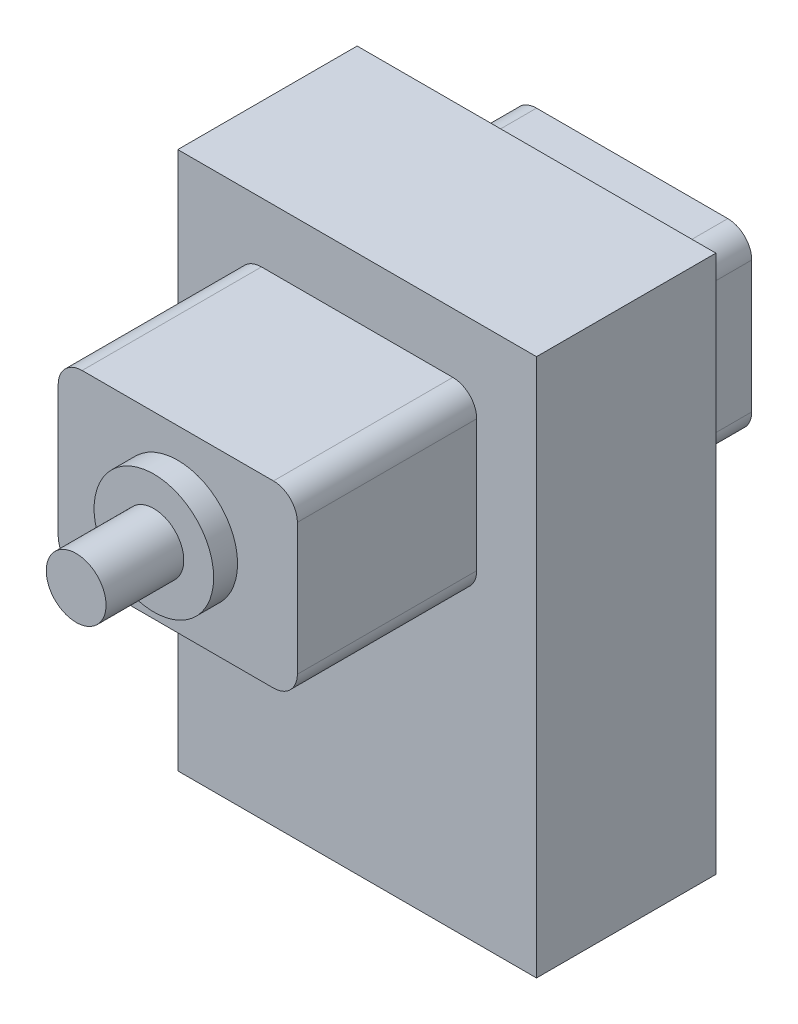
ISO-10303-21;
HEADER;
FILE_DESCRIPTION(('STEP AP214'),'2;1');
FILE_NAME('part.step','',(''),(''),'','','');
FILE_SCHEMA(('AUTOMOTIVE_DESIGN { 1 0 10303 214 1 1 1 1 }'));
ENDSEC;
DATA;
#1=APPLICATION_CONTEXT('core data for automotive mechanical design processes');
#2=APPLICATION_PROTOCOL_DEFINITION('international standard','automotive_design',2000,#1);
#3=PRODUCT_CONTEXT('',#1,'mechanical');
#4=PRODUCT('Part','Part','',(#3));
#5=PRODUCT_RELATED_PRODUCT_CATEGORY('part','',(#4));
#6=PRODUCT_DEFINITION_FORMATION('','',#4);
#7=PRODUCT_DEFINITION_CONTEXT('part definition',#1,'design');
#8=PRODUCT_DEFINITION('design','',#6,#7);
#9=PRODUCT_DEFINITION_SHAPE('','',#8);
#10=(LENGTH_UNIT() NAMED_UNIT(*) SI_UNIT(.MILLI.,.METRE.));
#11=(NAMED_UNIT(*) PLANE_ANGLE_UNIT() SI_UNIT($,.RADIAN.));
#12=(NAMED_UNIT(*) SI_UNIT($,.STERADIAN.) SOLID_ANGLE_UNIT());
#13=UNCERTAINTY_MEASURE_WITH_UNIT(LENGTH_MEASURE(1.E-05),#10,'distance_accuracy_value','');
#14=(GEOMETRIC_REPRESENTATION_CONTEXT(3) GLOBAL_UNCERTAINTY_ASSIGNED_CONTEXT((#13)) GLOBAL_UNIT_ASSIGNED_CONTEXT((#10,
#11,#12)) REPRESENTATION_CONTEXT('',''));
#15=CARTESIAN_POINT('',(0.,0.,0.));
#16=DIRECTION('',(0.,0.,1.));
#17=DIRECTION('',(1.,0.,0.));
#18=AXIS2_PLACEMENT_3D('',#15,#16,#17);
#19=CARTESIAN_POINT('',(0.,0.,0.));
#20=DIRECTION('',(0.,0.,1.));
#21=DIRECTION('',(1.,0.,0.));
#22=AXIS2_PLACEMENT_3D('',#19,#20,#21);
#23=PLANE('',#22);
#24=DIRECTION('',(0.,-1.,0.));
#25=VECTOR('',#24,1.);
#26=CARTESIAN_POINT('',(-30.,45.,0.));
#27=LINE('',#26,#25);
#28=CARTESIAN_POINT('',(-30.,45.,0.));
#29=VERTEX_POINT('',#28);
#30=CARTESIAN_POINT('',(-30.,0.,0.));
#31=VERTEX_POINT('',#30);
#32=EDGE_CURVE('E200',#29,#31,#27,.T.);
#33=ORIENTED_EDGE('',*,*,#32,.F.);
#34=DIRECTION('',(-1.,0.,0.));
#35=VECTOR('',#34,1.);
#36=CARTESIAN_POINT('',(-30.,45.,0.));
#37=LINE('',#36,#35);
#38=CARTESIAN_POINT('',(0.,45.,0.));
#39=VERTEX_POINT('',#38);
#40=EDGE_CURVE('E196',#39,#29,#37,.T.);
#41=ORIENTED_EDGE('',*,*,#40,.F.);
#42=DIRECTION('',(0.,1.,0.));
#43=VECTOR('',#42,1.);
#44=CARTESIAN_POINT('',(0.,45.,0.));
#45=LINE('',#44,#43);
#46=CARTESIAN_POINT('',(0.,0.,0.));
#47=VERTEX_POINT('',#46);
#48=EDGE_CURVE('E333',#47,#39,#45,.T.);
#49=ORIENTED_EDGE('',*,*,#48,.F.);
#50=DIRECTION('',(1.,0.,0.));
#51=VECTOR('',#50,1.);
#52=CARTESIAN_POINT('',(-30.,0.,0.));
#53=LINE('',#52,#51);
#54=EDGE_CURVE('E331',#31,#47,#53,.T.);
#55=ORIENTED_EDGE('',*,*,#54,.F.);
#56=EDGE_LOOP('',(#33,#41,#49,#55));
#57=FACE_BOUND('',#56,.T.);
#58=DIRECTION('',(0.,-1.,0.));
#59=VECTOR('',#58,1.);
#60=CARTESIAN_POINT('',(-5.,40.,0.));
#61=LINE('',#60,#59);
#62=CARTESIAN_POINT('',(-5.,38.,0.));
#63=VERTEX_POINT('',#62);
#64=CARTESIAN_POINT('',(-5.,27.,0.));
#65=VERTEX_POINT('',#64);
#66=EDGE_CURVE('E295',#63,#65,#61,.T.);
#67=ORIENTED_EDGE('',*,*,#66,.F.);
#68=CARTESIAN_POINT('',(-7.,38.,0.));
#69=DIRECTION('',(0.,0.,1.));
#70=DIRECTION('',(1.,0.,0.));
#71=AXIS2_PLACEMENT_3D('',#68,#69,#70);
#72=CIRCLE('',#71,2.);
#73=CARTESIAN_POINT('',(-7.,40.,0.));
#74=VERTEX_POINT('',#73);
#75=EDGE_CURVE('E53',#63,#74,#72,.T.);
#76=ORIENTED_EDGE('',*,*,#75,.T.);
#77=DIRECTION('',(1.,0.,0.));
#78=VECTOR('',#77,1.);
#79=CARTESIAN_POINT('',(-5.,40.,0.));
#80=LINE('',#79,#78);
#81=CARTESIAN_POINT('',(-23.,40.,0.));
#82=VERTEX_POINT('',#81);
#83=EDGE_CURVE('E285',#82,#74,#80,.T.);
#84=ORIENTED_EDGE('',*,*,#83,.F.);
#85=CARTESIAN_POINT('',(-23.,38.,0.));
#86=DIRECTION('',(0.,0.,1.));
#87=DIRECTION('',(1.,0.,0.));
#88=AXIS2_PLACEMENT_3D('',#85,#86,#87);
#89=CIRCLE('',#88,2.);
#90=CARTESIAN_POINT('',(-25.,38.,0.));
#91=VERTEX_POINT('',#90);
#92=EDGE_CURVE('E40',#82,#91,#89,.T.);
#93=ORIENTED_EDGE('',*,*,#92,.T.);
#94=DIRECTION('',(0.,1.,0.));
#95=VECTOR('',#94,1.);
#96=CARTESIAN_POINT('',(-25.,40.,0.));
#97=LINE('',#96,#95);
#98=CARTESIAN_POINT('',(-25.,27.,0.));
#99=VERTEX_POINT('',#98);
#100=EDGE_CURVE('E301',#99,#91,#97,.T.);
#101=ORIENTED_EDGE('',*,*,#100,.F.);
#102=CARTESIAN_POINT('',(-23.,27.,0.));
#103=DIRECTION('',(0.,0.,1.));
#104=DIRECTION('',(1.,0.,0.));
#105=AXIS2_PLACEMENT_3D('',#102,#103,#104);
#106=CIRCLE('',#105,2.);
#107=CARTESIAN_POINT('',(-23.,25.,0.));
#108=VERTEX_POINT('',#107);
#109=EDGE_CURVE('E271',#99,#108,#106,.T.);
#110=ORIENTED_EDGE('',*,*,#109,.T.);
#111=DIRECTION('',(-1.,0.,0.));
#112=VECTOR('',#111,1.);
#113=CARTESIAN_POINT('',(-5.,25.,0.));
#114=LINE('',#113,#112);
#115=CARTESIAN_POINT('',(-7.,25.,0.));
#116=VERTEX_POINT('',#115);
#117=EDGE_CURVE('E298',#116,#108,#114,.T.);
#118=ORIENTED_EDGE('',*,*,#117,.F.);
#119=CARTESIAN_POINT('',(-7.,27.,0.));
#120=DIRECTION('',(0.,0.,1.));
#121=DIRECTION('',(1.,0.,0.));
#122=AXIS2_PLACEMENT_3D('',#119,#120,#121);
#123=CIRCLE('',#122,2.);
#124=EDGE_CURVE('E269',#116,#65,#123,.T.);
#125=ORIENTED_EDGE('',*,*,#124,.T.);
#126=EDGE_LOOP('',(#67,#76,#84,#93,#101,#110,#118,#125));
#127=FACE_BOUND('',#126,.T.);
#128=ADVANCED_FACE('F36',(#57,#127),#23,.F.);
#129=CARTESIAN_POINT('',(-30.,45.,15.));
#130=DIRECTION('',(1.,0.,0.));
#131=DIRECTION('',(0.,0.,-1.));
#132=AXIS2_PLACEMENT_3D('',#129,#130,#131);
#133=PLANE('',#132);
#134=ORIENTED_EDGE('',*,*,#32,.T.);
#135=DIRECTION('',(0.,0.,-1.));
#136=VECTOR('',#135,1.);
#137=CARTESIAN_POINT('',(-30.,0.,15.));
#138=LINE('',#137,#136);
#139=CARTESIAN_POINT('',(-30.,0.,15.));
#140=VERTEX_POINT('',#139);
#141=EDGE_CURVE('E180',#140,#31,#138,.T.);
#142=ORIENTED_EDGE('',*,*,#141,.F.);
#143=DIRECTION('',(0.,-1.,0.));
#144=VECTOR('',#143,1.);
#145=CARTESIAN_POINT('',(-30.,45.,15.));
#146=LINE('',#145,#144);
#147=CARTESIAN_POINT('',(-30.,45.,15.));
#148=VERTEX_POINT('',#147);
#149=EDGE_CURVE('E187',#148,#140,#146,.T.);
#150=ORIENTED_EDGE('',*,*,#149,.F.);
#151=DIRECTION('',(0.,0.,-1.));
#152=VECTOR('',#151,1.);
#153=CARTESIAN_POINT('',(-30.,45.,15.));
#154=LINE('',#153,#152);
#155=EDGE_CURVE('E329',#148,#29,#154,.T.);
#156=ORIENTED_EDGE('',*,*,#155,.T.);
#157=EDGE_LOOP('',(#134,#142,#150,#156));
#158=FACE_BOUND('',#157,.T.);
#159=ADVANCED_FACE('F198',(#158),#133,.F.);
#160=CARTESIAN_POINT('',(-30.,0.,15.));
#161=DIRECTION('',(0.,1.,0.));
#162=DIRECTION('',(0.,0.,1.));
#163=AXIS2_PLACEMENT_3D('',#160,#161,#162);
#164=PLANE('',#163);
#165=ORIENTED_EDGE('',*,*,#54,.T.);
#166=DIRECTION('',(0.,0.,-1.));
#167=VECTOR('',#166,1.);
#168=CARTESIAN_POINT('',(0.,0.,15.));
#169=LINE('',#168,#167);
#170=CARTESIAN_POINT('',(0.,0.,15.));
#171=VERTEX_POINT('',#170);
#172=EDGE_CURVE('E183',#171,#47,#169,.T.);
#173=ORIENTED_EDGE('',*,*,#172,.F.);
#174=DIRECTION('',(1.,0.,0.));
#175=VECTOR('',#174,1.);
#176=CARTESIAN_POINT('',(-30.,0.,15.));
#177=LINE('',#176,#175);
#178=EDGE_CURVE('E176',#140,#171,#177,.T.);
#179=ORIENTED_EDGE('',*,*,#178,.F.);
#180=ORIENTED_EDGE('',*,*,#141,.T.);
#181=EDGE_LOOP('',(#165,#173,#179,#180));
#182=FACE_BOUND('',#181,.T.);
#183=ADVANCED_FACE('F178',(#182),#164,.F.);
#184=CARTESIAN_POINT('',(0.,45.,15.));
#185=DIRECTION('',(-1.,0.,0.));
#186=DIRECTION('',(0.,0.,1.));
#187=AXIS2_PLACEMENT_3D('',#184,#185,#186);
#188=PLANE('',#187);
#189=ORIENTED_EDGE('',*,*,#48,.T.);
#190=DIRECTION('',(0.,0.,-1.));
#191=VECTOR('',#190,1.);
#192=CARTESIAN_POINT('',(0.,45.,15.));
#193=LINE('',#192,#191);
#194=CARTESIAN_POINT('',(0.,45.,15.));
#195=VERTEX_POINT('',#194);
#196=EDGE_CURVE('E205',#195,#39,#193,.T.);
#197=ORIENTED_EDGE('',*,*,#196,.F.);
#198=DIRECTION('',(0.,1.,0.));
#199=VECTOR('',#198,1.);
#200=CARTESIAN_POINT('',(0.,45.,15.));
#201=LINE('',#200,#199);
#202=EDGE_CURVE('E186',#171,#195,#201,.T.);
#203=ORIENTED_EDGE('',*,*,#202,.F.);
#204=ORIENTED_EDGE('',*,*,#172,.T.);
#205=EDGE_LOOP('',(#189,#197,#203,#204));
#206=FACE_BOUND('',#205,.T.);
#207=ADVANCED_FACE('F344',(#206),#188,.F.);
#208=CARTESIAN_POINT('',(-30.,45.,15.));
#209=DIRECTION('',(0.,-1.,0.));
#210=DIRECTION('',(1.,0.,0.));
#211=AXIS2_PLACEMENT_3D('',#208,#209,#210);
#212=PLANE('',#211);
#213=ORIENTED_EDGE('',*,*,#40,.T.);
#214=ORIENTED_EDGE('',*,*,#155,.F.);
#215=DIRECTION('',(-1.,0.,0.));
#216=VECTOR('',#215,1.);
#217=CARTESIAN_POINT('',(-30.,45.,15.));
#218=LINE('',#217,#216);
#219=EDGE_CURVE('E192',#195,#148,#218,.T.);
#220=ORIENTED_EDGE('',*,*,#219,.F.);
#221=ORIENTED_EDGE('',*,*,#196,.T.);
#222=EDGE_LOOP('',(#213,#214,#220,#221));
#223=FACE_BOUND('',#222,.T.);
#224=ADVANCED_FACE('F340',(#223),#212,.F.);
#225=CARTESIAN_POINT('',(0.,0.,15.));
#226=DIRECTION('',(0.,0.,1.));
#227=DIRECTION('',(1.,0.,0.));
#228=AXIS2_PLACEMENT_3D('',#225,#226,#227);
#229=PLANE('',#228);
#230=DIRECTION('',(0.,-1.,0.));
#231=VECTOR('',#230,1.);
#232=CARTESIAN_POINT('',(-25.,40.,15.));
#233=LINE('',#232,#231);
#234=CARTESIAN_POINT('',(-25.,38.,15.));
#235=VERTEX_POINT('',#234);
#236=CARTESIAN_POINT('',(-25.,27.,15.));
#237=VERTEX_POINT('',#236);
#238=EDGE_CURVE('E294',#235,#237,#233,.T.);
#239=ORIENTED_EDGE('',*,*,#238,.F.);
#240=CARTESIAN_POINT('',(-23.,38.,15.));
#241=DIRECTION('',(0.,0.,1.));
#242=DIRECTION('',(1.,0.,0.));
#243=AXIS2_PLACEMENT_3D('',#240,#241,#242);
#244=CIRCLE('',#243,2.);
#245=CARTESIAN_POINT('',(-23.,40.,15.));
#246=VERTEX_POINT('',#245);
#247=EDGE_CURVE('E261',#235,#246,#244,.F.);
#248=ORIENTED_EDGE('',*,*,#247,.T.);
#249=DIRECTION('',(-1.,0.,0.));
#250=VECTOR('',#249,1.);
#251=CARTESIAN_POINT('',(-25.,40.,15.));
#252=LINE('',#251,#250);
#253=CARTESIAN_POINT('',(-7.,40.,15.));
#254=VERTEX_POINT('',#253);
#255=EDGE_CURVE('E308',#254,#246,#252,.T.);
#256=ORIENTED_EDGE('',*,*,#255,.F.);
#257=CARTESIAN_POINT('',(-7.,38.,15.));
#258=DIRECTION('',(0.,0.,1.));
#259=DIRECTION('',(1.,0.,0.));
#260=AXIS2_PLACEMENT_3D('',#257,#258,#259);
#261=CIRCLE('',#260,2.);
#262=CARTESIAN_POINT('',(-5.,38.,15.));
#263=VERTEX_POINT('',#262);
#264=EDGE_CURVE('E267',#254,#263,#261,.F.);
#265=ORIENTED_EDGE('',*,*,#264,.T.);
#266=DIRECTION('',(0.,1.,0.));
#267=VECTOR('',#266,1.);
#268=CARTESIAN_POINT('',(-5.,40.,15.));
#269=LINE('',#268,#267);
#270=CARTESIAN_POINT('',(-5.,27.,15.));
#271=VERTEX_POINT('',#270);
#272=EDGE_CURVE('E322',#271,#263,#269,.T.);
#273=ORIENTED_EDGE('',*,*,#272,.F.);
#274=CARTESIAN_POINT('',(-7.,27.,15.));
#275=DIRECTION('',(0.,0.,1.));
#276=DIRECTION('',(1.,0.,0.));
#277=AXIS2_PLACEMENT_3D('',#274,#275,#276);
#278=CIRCLE('',#277,2.);
#279=CARTESIAN_POINT('',(-7.,25.,15.));
#280=VERTEX_POINT('',#279);
#281=EDGE_CURVE('E265',#271,#280,#278,.F.);
#282=ORIENTED_EDGE('',*,*,#281,.T.);
#283=DIRECTION('',(1.,0.,0.));
#284=VECTOR('',#283,1.);
#285=CARTESIAN_POINT('',(-25.,25.,15.));
#286=LINE('',#285,#284);
#287=CARTESIAN_POINT('',(-23.,25.,15.));
#288=VERTEX_POINT('',#287);
#289=EDGE_CURVE('E319',#288,#280,#286,.T.);
#290=ORIENTED_EDGE('',*,*,#289,.F.);
#291=CARTESIAN_POINT('',(-23.,27.,15.));
#292=DIRECTION('',(0.,0.,1.));
#293=DIRECTION('',(1.,0.,0.));
#294=AXIS2_PLACEMENT_3D('',#291,#292,#293);
#295=CIRCLE('',#294,2.);
#296=EDGE_CURVE('E263',#288,#237,#295,.F.);
#297=ORIENTED_EDGE('',*,*,#296,.T.);
#298=EDGE_LOOP('',(#239,#248,#256,#265,#273,#282,#290,#297));
#299=FACE_BOUND('',#298,.T.);
#300=ORIENTED_EDGE('',*,*,#149,.T.);
#301=ORIENTED_EDGE('',*,*,#178,.T.);
#302=ORIENTED_EDGE('',*,*,#202,.T.);
#303=ORIENTED_EDGE('',*,*,#219,.T.);
#304=EDGE_LOOP('',(#300,#301,#302,#303));
#305=FACE_BOUND('',#304,.T.);
#306=ADVANCED_FACE('F190',(#299,#305),#229,.T.);
#307=CARTESIAN_POINT('',(-25.,40.,30.));
#308=DIRECTION('',(1.,0.,0.));
#309=DIRECTION('',(0.,0.,-1.));
#310=AXIS2_PLACEMENT_3D('',#307,#308,#309);
#311=PLANE('',#310);
#312=DIRECTION('',(0.,-1.,0.));
#313=VECTOR('',#312,1.);
#314=CARTESIAN_POINT('',(-25.,40.,30.));
#315=LINE('',#314,#313);
#316=CARTESIAN_POINT('',(-25.,38.,30.));
#317=VERTEX_POINT('',#316);
#318=CARTESIAN_POINT('',(-25.,27.,30.));
#319=VERTEX_POINT('',#318);
#320=EDGE_CURVE('E304',#317,#319,#315,.T.);
#321=ORIENTED_EDGE('',*,*,#320,.F.);
#322=DIRECTION('',(0.,0.,-1.));
#323=VECTOR('',#322,1.);
#324=CARTESIAN_POINT('',(-25.,38.,30.));
#325=LINE('',#324,#323);
#326=EDGE_CURVE('E203',#317,#235,#325,.T.);
#327=ORIENTED_EDGE('',*,*,#326,.T.);
#328=ORIENTED_EDGE('',*,*,#238,.T.);
#329=DIRECTION('',(0.,0.,-1.));
#330=VECTOR('',#329,1.);
#331=CARTESIAN_POINT('',(-25.,27.,30.));
#332=LINE('',#331,#330);
#333=EDGE_CURVE('E201',#237,#319,#332,.F.);
#334=ORIENTED_EDGE('',*,*,#333,.T.);
#335=EDGE_LOOP('',(#321,#327,#328,#334));
#336=FACE_BOUND('',#335,.T.);
#337=ADVANCED_FACE('F362',(#336),#311,.F.);
#338=CARTESIAN_POINT('',(-25.,25.,30.));
#339=DIRECTION('',(0.,1.,0.));
#340=DIRECTION('',(0.,0.,1.));
#341=AXIS2_PLACEMENT_3D('',#338,#339,#340);
#342=PLANE('',#341);
#343=DIRECTION('',(1.,0.,0.));
#344=VECTOR('',#343,1.);
#345=CARTESIAN_POINT('',(-25.,25.,30.));
#346=LINE('',#345,#344);
#347=CARTESIAN_POINT('',(-23.,25.,30.));
#348=VERTEX_POINT('',#347);
#349=CARTESIAN_POINT('',(-7.,25.,30.));
#350=VERTEX_POINT('',#349);
#351=EDGE_CURVE('E307',#348,#350,#346,.T.);
#352=ORIENTED_EDGE('',*,*,#351,.F.);
#353=DIRECTION('',(0.,0.,-1.));
#354=VECTOR('',#353,1.);
#355=CARTESIAN_POINT('',(-23.,25.,30.));
#356=LINE('',#355,#354);
#357=EDGE_CURVE('E226',#348,#288,#356,.T.);
#358=ORIENTED_EDGE('',*,*,#357,.T.);
#359=ORIENTED_EDGE('',*,*,#289,.T.);
#360=DIRECTION('',(0.,0.,-1.));
#361=VECTOR('',#360,1.);
#362=CARTESIAN_POINT('',(-7.,25.,30.));
#363=LINE('',#362,#361);
#364=EDGE_CURVE('E224',#280,#350,#363,.F.);
#365=ORIENTED_EDGE('',*,*,#364,.T.);
#366=EDGE_LOOP('',(#352,#358,#359,#365));
#367=FACE_BOUND('',#366,.T.);
#368=ADVANCED_FACE('F366',(#367),#342,.F.);
#369=CARTESIAN_POINT('',(-5.,40.,30.));
#370=DIRECTION('',(-1.,0.,0.));
#371=DIRECTION('',(0.,0.,1.));
#372=AXIS2_PLACEMENT_3D('',#369,#370,#371);
#373=PLANE('',#372);
#374=DIRECTION('',(0.,1.,0.));
#375=VECTOR('',#374,1.);
#376=CARTESIAN_POINT('',(-5.,40.,30.));
#377=LINE('',#376,#375);
#378=CARTESIAN_POINT('',(-5.,27.,30.));
#379=VERTEX_POINT('',#378);
#380=CARTESIAN_POINT('',(-5.,38.,30.));
#381=VERTEX_POINT('',#380);
#382=EDGE_CURVE('E311',#379,#381,#377,.T.);
#383=ORIENTED_EDGE('',*,*,#382,.F.);
#384=DIRECTION('',(0.,0.,-1.));
#385=VECTOR('',#384,1.);
#386=CARTESIAN_POINT('',(-5.,27.,30.));
#387=LINE('',#386,#385);
#388=EDGE_CURVE('E231',#379,#271,#387,.T.);
#389=ORIENTED_EDGE('',*,*,#388,.T.);
#390=ORIENTED_EDGE('',*,*,#272,.T.);
#391=DIRECTION('',(0.,0.,-1.));
#392=VECTOR('',#391,1.);
#393=CARTESIAN_POINT('',(-5.,38.,30.));
#394=LINE('',#393,#392);
#395=EDGE_CURVE('E229',#263,#381,#394,.F.);
#396=ORIENTED_EDGE('',*,*,#395,.T.);
#397=EDGE_LOOP('',(#383,#389,#390,#396));
#398=FACE_BOUND('',#397,.T.);
#399=ADVANCED_FACE('F370',(#398),#373,.F.);
#400=CARTESIAN_POINT('',(-25.,40.,30.));
#401=DIRECTION('',(0.,-1.,0.));
#402=DIRECTION('',(0.,0.,-1.));
#403=AXIS2_PLACEMENT_3D('',#400,#401,#402);
#404=PLANE('',#403);
#405=ORIENTED_EDGE('',*,*,#255,.T.);
#406=DIRECTION('',(0.,0.,-1.));
#407=VECTOR('',#406,1.);
#408=CARTESIAN_POINT('',(-23.,40.,30.));
#409=LINE('',#408,#407);
#410=CARTESIAN_POINT('',(-23.,40.,30.));
#411=VERTEX_POINT('',#410);
#412=EDGE_CURVE('E214',#246,#411,#409,.F.);
#413=ORIENTED_EDGE('',*,*,#412,.T.);
#414=DIRECTION('',(-1.,0.,0.));
#415=VECTOR('',#414,1.);
#416=CARTESIAN_POINT('',(-25.,40.,30.));
#417=LINE('',#416,#415);
#418=CARTESIAN_POINT('',(-7.,40.,30.));
#419=VERTEX_POINT('',#418);
#420=EDGE_CURVE('E314',#419,#411,#417,.T.);
#421=ORIENTED_EDGE('',*,*,#420,.F.);
#422=DIRECTION('',(0.,0.,-1.));
#423=VECTOR('',#422,1.);
#424=CARTESIAN_POINT('',(-7.,40.,30.));
#425=LINE('',#424,#423);
#426=EDGE_CURVE('E211',#419,#254,#425,.T.);
#427=ORIENTED_EDGE('',*,*,#426,.T.);
#428=EDGE_LOOP('',(#405,#413,#421,#427));
#429=FACE_BOUND('',#428,.T.);
#430=ADVANCED_FACE('F374',(#429),#404,.F.);
#431=CARTESIAN_POINT('',(0.,0.,30.));
#432=DIRECTION('',(0.,0.,1.));
#433=DIRECTION('',(1.,0.,0.));
#434=AXIS2_PLACEMENT_3D('',#431,#432,#433);
#435=PLANE('',#434);
#436=CARTESIAN_POINT('',(-15.,32.5,30.));
#437=DIRECTION('',(0.,0.,1.));
#438=DIRECTION('',(1.,0.,0.));
#439=AXIS2_PLACEMENT_3D('',#436,#437,#438);
#440=CIRCLE('',#439,5.);
#441=CARTESIAN_POINT('',(-10.,32.5,30.));
#442=VERTEX_POINT('',#441);
#443=EDGE_CURVE('E45',#442,#442,#440,.T.);
#444=ORIENTED_EDGE('',*,*,#443,.F.);
#445=EDGE_LOOP('',(#444));
#446=FACE_BOUND('',#445,.T.);
#447=ORIENTED_EDGE('',*,*,#420,.T.);
#448=CARTESIAN_POINT('',(-23.,38.,30.));
#449=DIRECTION('',(0.,0.,1.));
#450=DIRECTION('',(1.,0.,0.));
#451=AXIS2_PLACEMENT_3D('',#448,#449,#450);
#452=CIRCLE('',#451,2.);
#453=EDGE_CURVE('E222',#411,#317,#452,.T.);
#454=ORIENTED_EDGE('',*,*,#453,.T.);
#455=ORIENTED_EDGE('',*,*,#320,.T.);
#456=CARTESIAN_POINT('',(-23.,27.,30.));
#457=DIRECTION('',(0.,0.,1.));
#458=DIRECTION('',(1.,0.,0.));
#459=AXIS2_PLACEMENT_3D('',#456,#457,#458);
#460=CIRCLE('',#459,2.);
#461=EDGE_CURVE('E220',#319,#348,#460,.T.);
#462=ORIENTED_EDGE('',*,*,#461,.T.);
#463=ORIENTED_EDGE('',*,*,#351,.T.);
#464=CARTESIAN_POINT('',(-7.,27.,30.));
#465=DIRECTION('',(0.,0.,1.));
#466=DIRECTION('',(1.,0.,0.));
#467=AXIS2_PLACEMENT_3D('',#464,#465,#466);
#468=CIRCLE('',#467,2.);
#469=EDGE_CURVE('E218',#350,#379,#468,.T.);
#470=ORIENTED_EDGE('',*,*,#469,.T.);
#471=ORIENTED_EDGE('',*,*,#382,.T.);
#472=CARTESIAN_POINT('',(-7.,38.,30.));
#473=DIRECTION('',(0.,0.,1.));
#474=DIRECTION('',(1.,0.,0.));
#475=AXIS2_PLACEMENT_3D('',#472,#473,#474);
#476=CIRCLE('',#475,2.);
#477=EDGE_CURVE('E216',#381,#419,#476,.T.);
#478=ORIENTED_EDGE('',*,*,#477,.T.);
#479=EDGE_LOOP('',(#447,#454,#455,#462,#463,#470,#471,#478));
#480=FACE_BOUND('',#479,.T.);
#481=ADVANCED_FACE('F378',(#446,#480),#435,.T.);
#482=CARTESIAN_POINT('',(-5.,40.,-8.));
#483=DIRECTION('',(-1.,0.,0.));
#484=DIRECTION('',(0.,-1.,0.));
#485=AXIS2_PLACEMENT_3D('',#482,#483,#484);
#486=PLANE('',#485);
#487=ORIENTED_EDGE('',*,*,#66,.T.);
#488=DIRECTION('',(0.,0.,1.));
#489=VECTOR('',#488,1.);
#490=CARTESIAN_POINT('',(-5.,27.,-8.));
#491=LINE('',#490,#489);
#492=CARTESIAN_POINT('',(-5.,27.,-8.));
#493=VERTEX_POINT('',#492);
#494=EDGE_CURVE('E242',#65,#493,#491,.F.);
#495=ORIENTED_EDGE('',*,*,#494,.T.);
#496=DIRECTION('',(0.,-1.,0.));
#497=VECTOR('',#496,1.);
#498=CARTESIAN_POINT('',(-5.,40.,-8.));
#499=LINE('',#498,#497);
#500=CARTESIAN_POINT('',(-5.,38.,-8.));
#501=VERTEX_POINT('',#500);
#502=EDGE_CURVE('E281',#501,#493,#499,.T.);
#503=ORIENTED_EDGE('',*,*,#502,.F.);
#504=DIRECTION('',(0.,0.,1.));
#505=VECTOR('',#504,1.);
#506=CARTESIAN_POINT('',(-5.,38.,-8.));
#507=LINE('',#506,#505);
#508=EDGE_CURVE('E239',#501,#63,#507,.T.);
#509=ORIENTED_EDGE('',*,*,#508,.T.);
#510=EDGE_LOOP('',(#487,#495,#503,#509));
#511=FACE_BOUND('',#510,.T.);
#512=ADVANCED_FACE('F382',(#511),#486,.F.);
#513=CARTESIAN_POINT('',(-5.,25.,-8.));
#514=DIRECTION('',(0.,1.,0.));
#515=DIRECTION('',(0.,0.,1.));
#516=AXIS2_PLACEMENT_3D('',#513,#514,#515);
#517=PLANE('',#516);
#518=DIRECTION('',(-1.,0.,0.));
#519=VECTOR('',#518,1.);
#520=CARTESIAN_POINT('',(-5.,25.,-8.));
#521=LINE('',#520,#519);
#522=CARTESIAN_POINT('',(-7.,25.,-8.));
#523=VERTEX_POINT('',#522);
#524=CARTESIAN_POINT('',(-23.,25.,-8.));
#525=VERTEX_POINT('',#524);
#526=EDGE_CURVE('E284',#523,#525,#521,.T.);
#527=ORIENTED_EDGE('',*,*,#526,.F.);
#528=DIRECTION('',(0.,0.,1.));
#529=VECTOR('',#528,1.);
#530=CARTESIAN_POINT('',(-7.,25.,-8.));
#531=LINE('',#530,#529);
#532=EDGE_CURVE('E236',#523,#116,#531,.T.);
#533=ORIENTED_EDGE('',*,*,#532,.T.);
#534=ORIENTED_EDGE('',*,*,#117,.T.);
#535=DIRECTION('',(0.,0.,1.));
#536=VECTOR('',#535,1.);
#537=CARTESIAN_POINT('',(-23.,25.,-8.));
#538=LINE('',#537,#536);
#539=EDGE_CURVE('E234',#108,#525,#538,.F.);
#540=ORIENTED_EDGE('',*,*,#539,.T.);
#541=EDGE_LOOP('',(#527,#533,#534,#540));
#542=FACE_BOUND('',#541,.T.);
#543=ADVANCED_FACE('F386',(#542),#517,.F.);
#544=CARTESIAN_POINT('',(-25.,40.,-8.));
#545=DIRECTION('',(1.,0.,0.));
#546=DIRECTION('',(0.,1.,0.));
#547=AXIS2_PLACEMENT_3D('',#544,#545,#546);
#548=PLANE('',#547);
#549=DIRECTION('',(0.,1.,0.));
#550=VECTOR('',#549,1.);
#551=CARTESIAN_POINT('',(-25.,40.,-8.));
#552=LINE('',#551,#550);
#553=CARTESIAN_POINT('',(-25.,27.,-8.));
#554=VERTEX_POINT('',#553);
#555=CARTESIAN_POINT('',(-25.,38.,-8.));
#556=VERTEX_POINT('',#555);
#557=EDGE_CURVE('E288',#554,#556,#552,.T.);
#558=ORIENTED_EDGE('',*,*,#557,.F.);
#559=DIRECTION('',(0.,0.,1.));
#560=VECTOR('',#559,1.);
#561=CARTESIAN_POINT('',(-25.,27.,-8.));
#562=LINE('',#561,#560);
#563=EDGE_CURVE('E254',#554,#99,#562,.T.);
#564=ORIENTED_EDGE('',*,*,#563,.T.);
#565=ORIENTED_EDGE('',*,*,#100,.T.);
#566=DIRECTION('',(0.,0.,1.));
#567=VECTOR('',#566,1.);
#568=CARTESIAN_POINT('',(-25.,38.,-8.));
#569=LINE('',#568,#567);
#570=EDGE_CURVE('E252',#91,#556,#569,.F.);
#571=ORIENTED_EDGE('',*,*,#570,.T.);
#572=EDGE_LOOP('',(#558,#564,#565,#571));
#573=FACE_BOUND('',#572,.T.);
#574=ADVANCED_FACE('F390',(#573),#548,.F.);
#575=CARTESIAN_POINT('',(-5.,40.,-8.));
#576=DIRECTION('',(0.,-1.,0.));
#577=DIRECTION('',(0.,0.,-1.));
#578=AXIS2_PLACEMENT_3D('',#575,#576,#577);
#579=PLANE('',#578);
#580=ORIENTED_EDGE('',*,*,#83,.T.);
#581=DIRECTION('',(0.,0.,1.));
#582=VECTOR('',#581,1.);
#583=CARTESIAN_POINT('',(-7.,40.,-8.));
#584=LINE('',#583,#582);
#585=CARTESIAN_POINT('',(-7.,40.,-8.));
#586=VERTEX_POINT('',#585);
#587=EDGE_CURVE('E259',#74,#586,#584,.F.);
#588=ORIENTED_EDGE('',*,*,#587,.T.);
#589=DIRECTION('',(1.,0.,0.));
#590=VECTOR('',#589,1.);
#591=CARTESIAN_POINT('',(-5.,40.,-8.));
#592=LINE('',#591,#590);
#593=CARTESIAN_POINT('',(-23.,40.,-8.));
#594=VERTEX_POINT('',#593);
#595=EDGE_CURVE('E291',#594,#586,#592,.T.);
#596=ORIENTED_EDGE('',*,*,#595,.F.);
#597=DIRECTION('',(0.,0.,1.));
#598=VECTOR('',#597,1.);
#599=CARTESIAN_POINT('',(-23.,40.,-8.));
#600=LINE('',#599,#598);
#601=EDGE_CURVE('E257',#594,#82,#600,.T.);
#602=ORIENTED_EDGE('',*,*,#601,.T.);
#603=EDGE_LOOP('',(#580,#588,#596,#602));
#604=FACE_BOUND('',#603,.T.);
#605=ADVANCED_FACE('F394',(#604),#579,.F.);
#606=CARTESIAN_POINT('',(0.,0.,-8.));
#607=DIRECTION('',(0.,0.,-1.));
#608=DIRECTION('',(-1.,0.,0.));
#609=AXIS2_PLACEMENT_3D('',#606,#607,#608);
#610=PLANE('',#609);
#611=ORIENTED_EDGE('',*,*,#502,.T.);
#612=CARTESIAN_POINT('',(-7.,27.,-8.));
#613=DIRECTION('',(0.,0.,-1.));
#614=DIRECTION('',(-1.,0.,0.));
#615=AXIS2_PLACEMENT_3D('',#612,#613,#614);
#616=CIRCLE('',#615,2.);
#617=EDGE_CURVE('E250',#493,#523,#616,.T.);
#618=ORIENTED_EDGE('',*,*,#617,.T.);
#619=ORIENTED_EDGE('',*,*,#526,.T.);
#620=CARTESIAN_POINT('',(-23.,27.,-8.));
#621=DIRECTION('',(0.,0.,-1.));
#622=DIRECTION('',(-1.,0.,0.));
#623=AXIS2_PLACEMENT_3D('',#620,#621,#622);
#624=CIRCLE('',#623,2.);
#625=EDGE_CURVE('E248',#525,#554,#624,.T.);
#626=ORIENTED_EDGE('',*,*,#625,.T.);
#627=ORIENTED_EDGE('',*,*,#557,.T.);
#628=CARTESIAN_POINT('',(-23.,38.,-8.));
#629=DIRECTION('',(0.,0.,-1.));
#630=DIRECTION('',(-1.,0.,0.));
#631=AXIS2_PLACEMENT_3D('',#628,#629,#630);
#632=CIRCLE('',#631,2.);
#633=EDGE_CURVE('E244',#556,#594,#632,.T.);
#634=ORIENTED_EDGE('',*,*,#633,.T.);
#635=ORIENTED_EDGE('',*,*,#595,.T.);
#636=CARTESIAN_POINT('',(-7.,38.,-8.));
#637=DIRECTION('',(0.,0.,-1.));
#638=DIRECTION('',(-1.,0.,0.));
#639=AXIS2_PLACEMENT_3D('',#636,#637,#638);
#640=CIRCLE('',#639,2.);
#641=EDGE_CURVE('E246',#586,#501,#640,.T.);
#642=ORIENTED_EDGE('',*,*,#641,.T.);
#643=EDGE_LOOP('',(#611,#618,#619,#626,#627,#634,#635,#642));
#644=FACE_BOUND('',#643,.T.);
#645=ADVANCED_FACE('F398',(#644),#610,.T.);
#646=CARTESIAN_POINT('',(-23.,38.,30.));
#647=DIRECTION('',(0.,0.,-1.));
#648=DIRECTION('',(-1.,0.,0.));
#649=AXIS2_PLACEMENT_3D('',#646,#647,#648);
#650=CYLINDRICAL_SURFACE('',#649,2.);
#651=ORIENTED_EDGE('',*,*,#453,.F.);
#652=ORIENTED_EDGE('',*,*,#412,.F.);
#653=ORIENTED_EDGE('',*,*,#247,.F.);
#654=ORIENTED_EDGE('',*,*,#326,.F.);
#655=EDGE_LOOP('',(#651,#652,#653,#654));
#656=FACE_BOUND('',#655,.T.);
#657=ADVANCED_FACE('F402',(#656),#650,.T.);
#658=CARTESIAN_POINT('',(-23.,27.,30.));
#659=DIRECTION('',(0.,0.,-1.));
#660=DIRECTION('',(-1.,0.,0.));
#661=AXIS2_PLACEMENT_3D('',#658,#659,#660);
#662=CYLINDRICAL_SURFACE('',#661,2.);
#663=ORIENTED_EDGE('',*,*,#461,.F.);
#664=ORIENTED_EDGE('',*,*,#333,.F.);
#665=ORIENTED_EDGE('',*,*,#296,.F.);
#666=ORIENTED_EDGE('',*,*,#357,.F.);
#667=EDGE_LOOP('',(#663,#664,#665,#666));
#668=FACE_BOUND('',#667,.T.);
#669=ADVANCED_FACE('F486',(#668),#662,.T.);
#670=CARTESIAN_POINT('',(-7.,27.,30.));
#671=DIRECTION('',(0.,0.,-1.));
#672=DIRECTION('',(-1.,0.,0.));
#673=AXIS2_PLACEMENT_3D('',#670,#671,#672);
#674=CYLINDRICAL_SURFACE('',#673,2.);
#675=ORIENTED_EDGE('',*,*,#469,.F.);
#676=ORIENTED_EDGE('',*,*,#364,.F.);
#677=ORIENTED_EDGE('',*,*,#281,.F.);
#678=ORIENTED_EDGE('',*,*,#388,.F.);
#679=EDGE_LOOP('',(#675,#676,#677,#678));
#680=FACE_BOUND('',#679,.T.);
#681=ADVANCED_FACE('F478',(#680),#674,.T.);
#682=CARTESIAN_POINT('',(-7.,38.,30.));
#683=DIRECTION('',(0.,0.,-1.));
#684=DIRECTION('',(-1.,0.,0.));
#685=AXIS2_PLACEMENT_3D('',#682,#683,#684);
#686=CYLINDRICAL_SURFACE('',#685,2.);
#687=ORIENTED_EDGE('',*,*,#477,.F.);
#688=ORIENTED_EDGE('',*,*,#395,.F.);
#689=ORIENTED_EDGE('',*,*,#264,.F.);
#690=ORIENTED_EDGE('',*,*,#426,.F.);
#691=EDGE_LOOP('',(#687,#688,#689,#690));
#692=FACE_BOUND('',#691,.T.);
#693=ADVANCED_FACE('F470',(#692),#686,.T.);
#694=CARTESIAN_POINT('',(-7.,27.,-8.));
#695=DIRECTION('',(0.,0.,1.));
#696=DIRECTION('',(1.,0.,0.));
#697=AXIS2_PLACEMENT_3D('',#694,#695,#696);
#698=CYLINDRICAL_SURFACE('',#697,2.);
#699=ORIENTED_EDGE('',*,*,#617,.F.);
#700=ORIENTED_EDGE('',*,*,#494,.F.);
#701=ORIENTED_EDGE('',*,*,#124,.F.);
#702=ORIENTED_EDGE('',*,*,#532,.F.);
#703=EDGE_LOOP('',(#699,#700,#701,#702));
#704=FACE_BOUND('',#703,.T.);
#705=ADVANCED_FACE('F462',(#704),#698,.T.);
#706=CARTESIAN_POINT('',(-23.,27.,-8.));
#707=DIRECTION('',(0.,0.,1.));
#708=DIRECTION('',(1.,0.,0.));
#709=AXIS2_PLACEMENT_3D('',#706,#707,#708);
#710=CYLINDRICAL_SURFACE('',#709,2.);
#711=ORIENTED_EDGE('',*,*,#625,.F.);
#712=ORIENTED_EDGE('',*,*,#539,.F.);
#713=ORIENTED_EDGE('',*,*,#109,.F.);
#714=ORIENTED_EDGE('',*,*,#563,.F.);
#715=EDGE_LOOP('',(#711,#712,#713,#714));
#716=FACE_BOUND('',#715,.T.);
#717=ADVANCED_FACE('F455',(#716),#710,.T.);
#718=CARTESIAN_POINT('',(-7.,38.,-8.));
#719=DIRECTION('',(0.,0.,1.));
#720=DIRECTION('',(1.,0.,0.));
#721=AXIS2_PLACEMENT_3D('',#718,#719,#720);
#722=CYLINDRICAL_SURFACE('',#721,2.);
#723=ORIENTED_EDGE('',*,*,#641,.F.);
#724=ORIENTED_EDGE('',*,*,#587,.F.);
#725=ORIENTED_EDGE('',*,*,#75,.F.);
#726=ORIENTED_EDGE('',*,*,#508,.F.);
#727=EDGE_LOOP('',(#723,#724,#725,#726));
#728=FACE_BOUND('',#727,.T.);
#729=ADVANCED_FACE('F449',(#728),#722,.T.);
#730=CARTESIAN_POINT('',(-23.,38.,-8.));
#731=DIRECTION('',(0.,0.,1.));
#732=DIRECTION('',(1.,0.,0.));
#733=AXIS2_PLACEMENT_3D('',#730,#731,#732);
#734=CYLINDRICAL_SURFACE('',#733,2.);
#735=ORIENTED_EDGE('',*,*,#633,.F.);
#736=ORIENTED_EDGE('',*,*,#570,.F.);
#737=ORIENTED_EDGE('',*,*,#92,.F.);
#738=ORIENTED_EDGE('',*,*,#601,.F.);
#739=EDGE_LOOP('',(#735,#736,#737,#738));
#740=FACE_BOUND('',#739,.T.);
#741=ADVANCED_FACE('F38',(#740),#734,.T.);
#742=CARTESIAN_POINT('',(-15.,32.5,32.));
#743=DIRECTION('',(0.,0.,-1.));
#744=DIRECTION('',(-1.,0.,0.));
#745=AXIS2_PLACEMENT_3D('',#742,#743,#744);
#746=CYLINDRICAL_SURFACE('',#745,5.);
#747=CARTESIAN_POINT('',(-15.,32.5,32.));
#748=DIRECTION('',(0.,0.,1.));
#749=DIRECTION('',(1.,0.,0.));
#750=AXIS2_PLACEMENT_3D('',#747,#748,#749);
#751=CIRCLE('',#750,5.);
#752=CARTESIAN_POINT('',(-10.,32.5,32.));
#753=VERTEX_POINT('',#752);
#754=EDGE_CURVE('E280',#753,#753,#751,.T.);
#755=ORIENTED_EDGE('',*,*,#754,.F.);
#756=EDGE_LOOP('',(#755));
#757=FACE_BOUND('',#756,.T.);
#758=ORIENTED_EDGE('',*,*,#443,.T.);
#759=EDGE_LOOP('',(#758));
#760=FACE_BOUND('',#759,.T.);
#761=ADVANCED_FACE('F404',(#757,#760),#746,.T.);
#762=CARTESIAN_POINT('',(-15.,32.5,32.));
#763=DIRECTION('',(0.,0.,1.));
#764=DIRECTION('',(1.,0.,0.));
#765=AXIS2_PLACEMENT_3D('',#762,#763,#764);
#766=PLANE('',#765);
#767=CARTESIAN_POINT('',(-15.,32.5,32.));
#768=DIRECTION('',(0.,0.,1.));
#769=DIRECTION('',(1.,0.,0.));
#770=AXIS2_PLACEMENT_3D('',#767,#768,#769);
#771=CIRCLE('',#770,2.5);
#772=CARTESIAN_POINT('',(-17.5,32.5,32.));
#773=VERTEX_POINT('',#772);
#774=EDGE_CURVE('E11',#773,#773,#771,.T.);
#775=ORIENTED_EDGE('',*,*,#774,.F.);
#776=EDGE_LOOP('',(#775));
#777=FACE_BOUND('',#776,.T.);
#778=ORIENTED_EDGE('',*,*,#754,.T.);
#779=EDGE_LOOP('',(#778));
#780=FACE_BOUND('',#779,.T.);
#781=ADVANCED_FACE('F407',(#777,#780),#766,.T.);
#782=CARTESIAN_POINT('',(-15.,32.5,38.5));
#783=DIRECTION('',(0.,0.,-1.));
#784=DIRECTION('',(-1.,0.,0.));
#785=AXIS2_PLACEMENT_3D('',#782,#783,#784);
#786=CYLINDRICAL_SURFACE('',#785,2.5);
#787=CARTESIAN_POINT('',(-15.,32.5,38.5));
#788=DIRECTION('',(0.,0.,1.));
#789=DIRECTION('',(1.,0.,0.));
#790=AXIS2_PLACEMENT_3D('',#787,#788,#789);
#791=CIRCLE('',#790,2.5);
#792=CARTESIAN_POINT('',(-17.5,32.5,38.5));
#793=VERTEX_POINT('',#792);
#794=EDGE_CURVE('E423',#793,#793,#791,.T.);
#795=CARTESIAN_POINT('',(-17.5,32.5,38.5));
#796=CARTESIAN_POINT('',(-17.5,32.5,38.4322916666667));
#797=CARTESIAN_POINT('',(-17.5,32.5,38.3645833333333));
#798=CARTESIAN_POINT('',(-17.5,32.5,38.2291666666667));
#799=CARTESIAN_POINT('',(-17.5,32.5,38.1614583333333));
#800=CARTESIAN_POINT('',(-17.5,32.5,38.0260416666667));
#801=CARTESIAN_POINT('',(-17.5,32.5,37.9583333333333));
#802=CARTESIAN_POINT('',(-17.5,32.5,37.8229166666667));
#803=CARTESIAN_POINT('',(-17.5,32.5,37.7552083333333));
#804=CARTESIAN_POINT('',(-17.5,32.5,37.6197916666667));
#805=CARTESIAN_POINT('',(-17.5,32.5,37.5520833333333));
#806=CARTESIAN_POINT('',(-17.5,32.5,37.4166666666667));
#807=CARTESIAN_POINT('',(-17.5,32.5,37.3489583333333));
#808=CARTESIAN_POINT('',(-17.5,32.5,37.2135416666667));
#809=CARTESIAN_POINT('',(-17.5,32.5,37.1458333333333));
#810=CARTESIAN_POINT('',(-17.5,32.5,37.0104166666667));
#811=CARTESIAN_POINT('',(-17.5,32.5,36.9427083333333));
#812=CARTESIAN_POINT('',(-17.5,32.5,36.8072916666667));
#813=CARTESIAN_POINT('',(-17.5,32.5,36.7395833333333));
#814=CARTESIAN_POINT('',(-17.5,32.5,36.6041666666667));
#815=CARTESIAN_POINT('',(-17.5,32.5,36.5364583333333));
#816=CARTESIAN_POINT('',(-17.5,32.5,36.4010416666667));
#817=CARTESIAN_POINT('',(-17.5,32.5,36.3333333333333));
#818=CARTESIAN_POINT('',(-17.5,32.5,36.1979166666667));
#819=CARTESIAN_POINT('',(-17.5,32.5,36.1302083333333));
#820=CARTESIAN_POINT('',(-17.5,32.5,35.9947916666667));
#821=CARTESIAN_POINT('',(-17.5,32.5,35.9270833333333));
#822=CARTESIAN_POINT('',(-17.5,32.5,35.7916666666667));
#823=CARTESIAN_POINT('',(-17.5,32.5,35.7239583333333));
#824=CARTESIAN_POINT('',(-17.5,32.5,35.5885416666667));
#825=CARTESIAN_POINT('',(-17.5,32.5,35.5208333333333));
#826=CARTESIAN_POINT('',(-17.5,32.5,35.3854166666667));
#827=CARTESIAN_POINT('',(-17.5,32.5,35.3177083333333));
#828=CARTESIAN_POINT('',(-17.5,32.5,35.1822916666667));
#829=CARTESIAN_POINT('',(-17.5,32.5,35.1145833333333));
#830=CARTESIAN_POINT('',(-17.5,32.5,34.9791666666667));
#831=CARTESIAN_POINT('',(-17.5,32.5,34.9114583333333));
#832=CARTESIAN_POINT('',(-17.5,32.5,34.7760416666667));
#833=CARTESIAN_POINT('',(-17.5,32.5,34.7083333333333));
#834=CARTESIAN_POINT('',(-17.5,32.5,34.5729166666667));
#835=CARTESIAN_POINT('',(-17.5,32.5,34.5052083333333));
#836=CARTESIAN_POINT('',(-17.5,32.5,34.3697916666667));
#837=CARTESIAN_POINT('',(-17.5,32.5,34.3020833333333));
#838=CARTESIAN_POINT('',(-17.5,32.5,34.1666666666667));
#839=CARTESIAN_POINT('',(-17.5,32.5,34.0989583333333));
#840=CARTESIAN_POINT('',(-17.5,32.5,33.9635416666667));
#841=CARTESIAN_POINT('',(-17.5,32.5,33.8958333333333));
#842=CARTESIAN_POINT('',(-17.5,32.5,33.7604166666667));
#843=CARTESIAN_POINT('',(-17.5,32.5,33.6927083333333));
#844=CARTESIAN_POINT('',(-17.5,32.5,33.5572916666667));
#845=CARTESIAN_POINT('',(-17.5,32.5,33.4895833333333));
#846=CARTESIAN_POINT('',(-17.5,32.5,33.3541666666667));
#847=CARTESIAN_POINT('',(-17.5,32.5,33.2864583333333));
#848=CARTESIAN_POINT('',(-17.5,32.5,33.1510416666667));
#849=CARTESIAN_POINT('',(-17.5,32.5,33.0833333333333));
#850=CARTESIAN_POINT('',(-17.5,32.5,32.9479166666667));
#851=CARTESIAN_POINT('',(-17.5,32.5,32.8802083333333));
#852=CARTESIAN_POINT('',(-17.5,32.5,32.7447916666667));
#853=CARTESIAN_POINT('',(-17.5,32.5,32.6770833333333));
#854=CARTESIAN_POINT('',(-17.5,32.5,32.5416666666667));
#855=CARTESIAN_POINT('',(-17.5,32.5,32.4739583333333));
#856=CARTESIAN_POINT('',(-17.5,32.5,32.3385416666667));
#857=CARTESIAN_POINT('',(-17.5,32.5,32.2708333333333));
#858=CARTESIAN_POINT('',(-17.5,32.5,32.1354166666667));
#859=CARTESIAN_POINT('',(-17.5,32.5,32.0677083333333));
#860=CARTESIAN_POINT('',(-17.5,32.5,32.));
#861=B_SPLINE_CURVE_WITH_KNOTS('',3,(#795,#796,#797,#798,#799,#800,#801,#802,#803,#804,#805,
#806,#807,#808,#809,#810,#811,#812,#813,#814,#815,#816,#817,#818,#819,#820,#821,#822,#823,#824,
#825,#826,#827,#828,#829,#830,#831,#832,#833,#834,#835,#836,#837,#838,#839,#840,#841,#842,#843,
#844,#845,#846,#847,#848,#849,#850,#851,#852,#853,#854,#855,#856,#857,#858,#859,#860),
.UNSPECIFIED.,.F.,.F.,(4,2,2,2,2,2,2,2,2,2,2,2,2,2,2,2,2,2,2,2,2,2,2,2,2,2,2,2,2,2,2,2,4),(0.,
0.203124999999998,0.406249999999997,0.609374999999995,0.812499999999994,1.015625,1.21875,
1.421875,1.62499999999999,1.828125,2.03125,2.234375,2.4375,2.64062499999999,2.84375,3.046875,
3.25,3.45312499999999,3.65625,3.859375,4.0625,4.26562499999999,4.46874999999999,4.671875,4.875,
5.078125,5.28124999999999,5.484375,5.6875,5.890625,6.09374999999999,6.29687499999999,6.5),.UNSPECIFIED.);
#862=EDGE_CURVE('BSEAM411',#793,#773,#861,.T.);
#863=ORIENTED_EDGE('',*,*,#794,.F.);
#864=ORIENTED_EDGE('',*,*,#774,.T.);
#865=ORIENTED_EDGE('',*,*,#862,.T.);
#866=ORIENTED_EDGE('',*,*,#862,.F.);
#867=EDGE_LOOP('',(#863,#865,#864,#866));
#868=FACE_BOUND('',#867,.T.);
#869=ADVANCED_FACE('F411',(#868),#786,.T.);
#870=CARTESIAN_POINT('',(-15.,32.5,38.5));
#871=DIRECTION('',(0.,0.,1.));
#872=DIRECTION('',(1.,0.,0.));
#873=AXIS2_PLACEMENT_3D('',#870,#871,#872);
#874=PLANE('',#873);
#875=ORIENTED_EDGE('',*,*,#794,.T.);
#876=EDGE_LOOP('',(#875));
#877=FACE_BOUND('',#876,.T.);
#878=ADVANCED_FACE('F415',(#877),#874,.T.);
#879=CLOSED_SHELL('',(#128,#159,#183,#207,#224,#306,#337,#368,#399,#430,#481,#512,#543,#574,
#605,#645,#657,#669,#681,#693,#705,#717,#729,#741,#761,#781,#869,#878));
#880=MANIFOLD_SOLID_BREP('B2',#879);
#881=ADVANCED_BREP_SHAPE_REPRESENTATION('',(#18,#880),#14);
#882=SHAPE_DEFINITION_REPRESENTATION(#9,#881);
ENDSEC;
END-ISO-10303-21;
